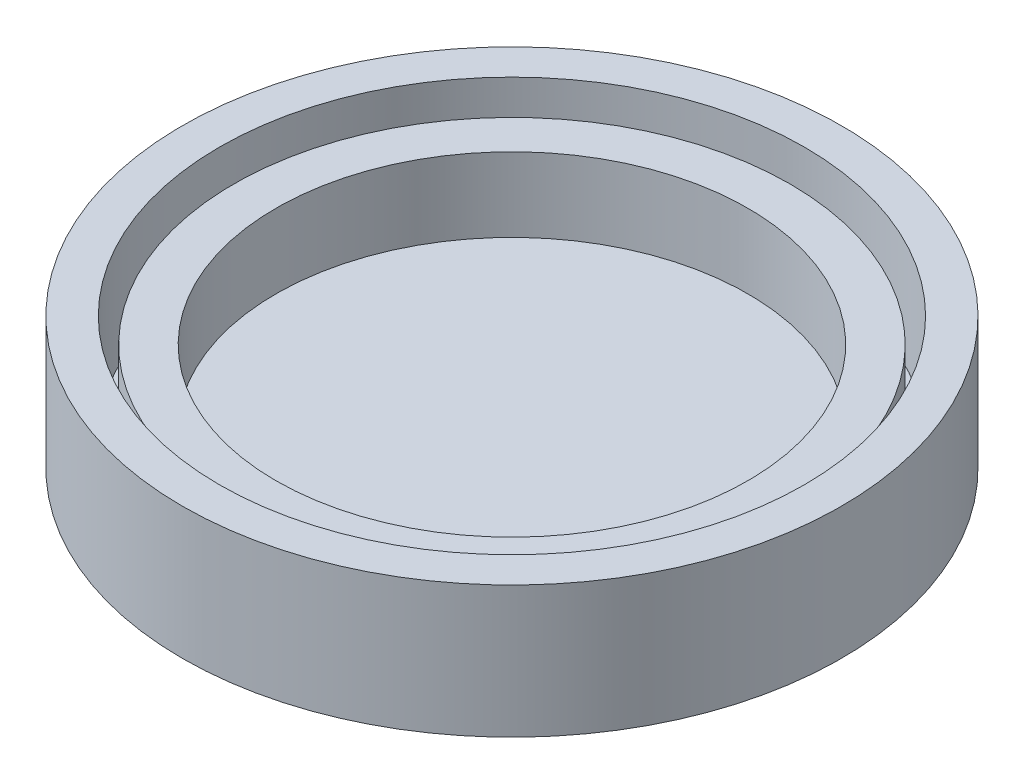
ISO-10303-21;
HEADER;
FILE_DESCRIPTION(('STEP AP214'),'2;1');
FILE_NAME('part.step','',(''),(''),'','','');
FILE_SCHEMA(('AUTOMOTIVE_DESIGN { 1 0 10303 214 1 1 1 1 }'));
ENDSEC;
DATA;
#1=APPLICATION_CONTEXT('core data for automotive mechanical design processes');
#2=APPLICATION_PROTOCOL_DEFINITION('international standard','automotive_design',2000,#1);
#3=PRODUCT_CONTEXT('',#1,'mechanical');
#4=PRODUCT('Part','Part','',(#3));
#5=PRODUCT_RELATED_PRODUCT_CATEGORY('part','',(#4));
#6=PRODUCT_DEFINITION_FORMATION('','',#4);
#7=PRODUCT_DEFINITION_CONTEXT('part definition',#1,'design');
#8=PRODUCT_DEFINITION('design','',#6,#7);
#9=PRODUCT_DEFINITION_SHAPE('','',#8);
#10=(LENGTH_UNIT() NAMED_UNIT(*) SI_UNIT(.MILLI.,.METRE.));
#11=(NAMED_UNIT(*) PLANE_ANGLE_UNIT() SI_UNIT($,.RADIAN.));
#12=(NAMED_UNIT(*) SI_UNIT($,.STERADIAN.) SOLID_ANGLE_UNIT());
#13=UNCERTAINTY_MEASURE_WITH_UNIT(LENGTH_MEASURE(1.E-05),#10,'distance_accuracy_value','');
#14=(GEOMETRIC_REPRESENTATION_CONTEXT(3) GLOBAL_UNCERTAINTY_ASSIGNED_CONTEXT((#13)) GLOBAL_UNIT_ASSIGNED_CONTEXT((#10,
#11,#12)) REPRESENTATION_CONTEXT('',''));
#15=CARTESIAN_POINT('',(0.,0.,0.));
#16=DIRECTION('',(0.,0.,1.));
#17=DIRECTION('',(1.,0.,0.));
#18=AXIS2_PLACEMENT_3D('',#15,#16,#17);
#19=CARTESIAN_POINT('',(0.,16.,0.));
#20=DIRECTION('',(0.,1.,0.));
#21=DIRECTION('',(0.,0.,1.));
#22=AXIS2_PLACEMENT_3D('',#19,#20,#21);
#23=PLANE('',#22);
#24=CARTESIAN_POINT('',(0.,16.,0.));
#25=DIRECTION('',(0.,1.,0.));
#26=DIRECTION('',(0.,0.,1.));
#27=AXIS2_PLACEMENT_3D('',#24,#25,#26);
#28=CIRCLE('',#27,35.5);
#29=CARTESIAN_POINT('',(0.,16.,35.5));
#30=VERTEX_POINT('',#29);
#31=EDGE_CURVE('E55',#30,#30,#28,.T.);
#32=ORIENTED_EDGE('',*,*,#31,.F.);
#33=EDGE_LOOP('',(#32));
#34=FACE_BOUND('',#33,.T.);
#35=CARTESIAN_POINT('',(0.,16.,0.));
#36=DIRECTION('',(0.,1.,0.));
#37=DIRECTION('',(0.,0.,1.));
#38=AXIS2_PLACEMENT_3D('',#35,#36,#37);
#39=CIRCLE('',#38,40.);
#40=CARTESIAN_POINT('',(0.,16.,40.));
#41=VERTEX_POINT('',#40);
#42=EDGE_CURVE('E45',#41,#41,#39,.T.);
#43=ORIENTED_EDGE('',*,*,#42,.T.);
#44=EDGE_LOOP('',(#43));
#45=FACE_BOUND('',#44,.T.);
#46=ADVANCED_FACE('F37',(#34,#45),#23,.T.);
#47=CARTESIAN_POINT('',(0.,0.,0.));
#48=DIRECTION('',(0.,1.,0.));
#49=DIRECTION('',(0.,0.,1.));
#50=AXIS2_PLACEMENT_3D('',#47,#48,#49);
#51=PLANE('',#50);
#52=CARTESIAN_POINT('',(0.,0.,0.));
#53=DIRECTION('',(0.,1.,0.));
#54=DIRECTION('',(0.,0.,1.));
#55=AXIS2_PLACEMENT_3D('',#52,#53,#54);
#56=CIRCLE('',#55,40.);
#57=CARTESIAN_POINT('',(0.,0.,40.));
#58=VERTEX_POINT('',#57);
#59=EDGE_CURVE('E10',#58,#58,#56,.T.);
#60=ORIENTED_EDGE('',*,*,#59,.F.);
#61=EDGE_LOOP('',(#60));
#62=FACE_BOUND('',#61,.T.);
#63=ADVANCED_FACE('F96',(#62),#51,.F.);
#64=CARTESIAN_POINT('',(0.,13.,0.));
#65=DIRECTION('',(0.,-1.,0.));
#66=DIRECTION('',(0.,0.,-1.));
#67=AXIS2_PLACEMENT_3D('',#64,#65,#66);
#68=CYLINDRICAL_SURFACE('',#67,40.);
#69=ORIENTED_EDGE('',*,*,#59,.T.);
#70=EDGE_LOOP('',(#69));
#71=FACE_BOUND('',#70,.T.);
#72=ORIENTED_EDGE('',*,*,#42,.F.);
#73=EDGE_LOOP('',(#72));
#74=FACE_BOUND('',#73,.T.);
#75=ADVANCED_FACE('F39',(#71,#74),#68,.T.);
#76=CARTESIAN_POINT('',(0.,3.,0.));
#77=DIRECTION('',(0.,1.,0.));
#78=DIRECTION('',(0.,0.,1.));
#79=AXIS2_PLACEMENT_3D('',#76,#77,#78);
#80=CYLINDRICAL_SURFACE('',#79,35.5);
#81=CARTESIAN_POINT('',(0.,3.,0.));
#82=DIRECTION('',(0.,1.,0.));
#83=DIRECTION('',(0.,0.,1.));
#84=AXIS2_PLACEMENT_3D('',#81,#82,#83);
#85=CIRCLE('',#84,35.5);
#86=CARTESIAN_POINT('',(0.,3.,35.5));
#87=VERTEX_POINT('',#86);
#88=EDGE_CURVE('E50',#87,#87,#85,.T.);
#89=ORIENTED_EDGE('',*,*,#88,.F.);
#90=EDGE_LOOP('',(#89));
#91=FACE_BOUND('',#90,.T.);
#92=ORIENTED_EDGE('',*,*,#31,.T.);
#93=EDGE_LOOP('',(#92));
#94=FACE_BOUND('',#93,.T.);
#95=ADVANCED_FACE('F106',(#91,#94),#80,.F.);
#96=CARTESIAN_POINT('',(0.,3.,0.));
#97=DIRECTION('',(0.,1.,0.));
#98=DIRECTION('',(0.,0.,1.));
#99=AXIS2_PLACEMENT_3D('',#96,#97,#98);
#100=PLANE('',#99);
#101=CARTESIAN_POINT('',(0.,3.,0.));
#102=DIRECTION('',(0.,1.,0.));
#103=DIRECTION('',(0.,0.,1.));
#104=AXIS2_PLACEMENT_3D('',#101,#102,#103);
#105=CIRCLE('',#104,33.75);
#106=CARTESIAN_POINT('',(0.,3.,-33.75));
#107=VERTEX_POINT('',#106);
#108=EDGE_CURVE('E60',#107,#107,#105,.T.);
#109=ORIENTED_EDGE('',*,*,#108,.F.);
#110=EDGE_LOOP('',(#109));
#111=FACE_BOUND('',#110,.T.);
#112=ORIENTED_EDGE('',*,*,#88,.T.);
#113=EDGE_LOOP('',(#112));
#114=FACE_BOUND('',#113,.T.);
#115=ADVANCED_FACE('F92',(#111,#114),#100,.T.);
#116=CARTESIAN_POINT('',(0.,10.,0.));
#117=DIRECTION('',(0.,-1.,0.));
#118=DIRECTION('',(0.,0.,-1.));
#119=AXIS2_PLACEMENT_3D('',#116,#117,#118);
#120=CYLINDRICAL_SURFACE('',#119,33.75);
#121=CARTESIAN_POINT('',(0.,13.,0.));
#122=DIRECTION('',(0.,1.,0.));
#123=DIRECTION('',(0.,0.,1.));
#124=AXIS2_PLACEMENT_3D('',#121,#122,#123);
#125=CIRCLE('',#124,33.75);
#126=CARTESIAN_POINT('',(0.,13.,-33.75));
#127=VERTEX_POINT('',#126);
#128=EDGE_CURVE('E69',#127,#127,#125,.T.);
#129=CARTESIAN_POINT('',(0.,3.,-33.75));
#130=CARTESIAN_POINT('',(0.,3.10416666666667,-33.75));
#131=CARTESIAN_POINT('',(0.,3.20833333333333,-33.75));
#132=CARTESIAN_POINT('',(0.,3.41666666666667,-33.75));
#133=CARTESIAN_POINT('',(0.,3.52083333333333,-33.75));
#134=CARTESIAN_POINT('',(0.,3.72916666666667,-33.75));
#135=CARTESIAN_POINT('',(0.,3.83333333333333,-33.75));
#136=CARTESIAN_POINT('',(0.,4.04166666666667,-33.75));
#137=CARTESIAN_POINT('',(0.,4.14583333333333,-33.75));
#138=CARTESIAN_POINT('',(0.,4.35416666666667,-33.75));
#139=CARTESIAN_POINT('',(0.,4.45833333333333,-33.75));
#140=CARTESIAN_POINT('',(0.,4.66666666666667,-33.75));
#141=CARTESIAN_POINT('',(0.,4.77083333333333,-33.75));
#142=CARTESIAN_POINT('',(0.,4.97916666666667,-33.75));
#143=CARTESIAN_POINT('',(0.,5.08333333333333,-33.75));
#144=CARTESIAN_POINT('',(0.,5.29166666666667,-33.75));
#145=CARTESIAN_POINT('',(0.,5.39583333333333,-33.75));
#146=CARTESIAN_POINT('',(0.,5.60416666666667,-33.75));
#147=CARTESIAN_POINT('',(0.,5.70833333333333,-33.75));
#148=CARTESIAN_POINT('',(0.,5.91666666666667,-33.75));
#149=CARTESIAN_POINT('',(0.,6.02083333333333,-33.75));
#150=CARTESIAN_POINT('',(0.,6.22916666666667,-33.75));
#151=CARTESIAN_POINT('',(0.,6.33333333333333,-33.75));
#152=CARTESIAN_POINT('',(0.,6.54166666666667,-33.75));
#153=CARTESIAN_POINT('',(0.,6.64583333333333,-33.75));
#154=CARTESIAN_POINT('',(0.,6.85416666666667,-33.75));
#155=CARTESIAN_POINT('',(0.,6.95833333333333,-33.75));
#156=CARTESIAN_POINT('',(0.,7.16666666666667,-33.75));
#157=CARTESIAN_POINT('',(0.,7.27083333333333,-33.75));
#158=CARTESIAN_POINT('',(0.,7.47916666666667,-33.75));
#159=CARTESIAN_POINT('',(0.,7.58333333333333,-33.75));
#160=CARTESIAN_POINT('',(0.,7.79166666666667,-33.75));
#161=CARTESIAN_POINT('',(0.,7.89583333333333,-33.75));
#162=CARTESIAN_POINT('',(0.,8.10416666666667,-33.75));
#163=CARTESIAN_POINT('',(0.,8.20833333333333,-33.75));
#164=CARTESIAN_POINT('',(0.,8.41666666666667,-33.75));
#165=CARTESIAN_POINT('',(0.,8.52083333333333,-33.75));
#166=CARTESIAN_POINT('',(0.,8.72916666666667,-33.75));
#167=CARTESIAN_POINT('',(0.,8.83333333333333,-33.75));
#168=CARTESIAN_POINT('',(0.,9.04166666666667,-33.75));
#169=CARTESIAN_POINT('',(0.,9.14583333333333,-33.75));
#170=CARTESIAN_POINT('',(0.,9.35416666666667,-33.75));
#171=CARTESIAN_POINT('',(0.,9.45833333333333,-33.75));
#172=CARTESIAN_POINT('',(0.,9.66666666666667,-33.75));
#173=CARTESIAN_POINT('',(0.,9.77083333333333,-33.75));
#174=CARTESIAN_POINT('',(0.,9.97916666666667,-33.75));
#175=CARTESIAN_POINT('',(0.,10.0833333333333,-33.75));
#176=CARTESIAN_POINT('',(0.,10.2916666666667,-33.75));
#177=CARTESIAN_POINT('',(0.,10.3958333333333,-33.75));
#178=CARTESIAN_POINT('',(0.,10.6041666666667,-33.75));
#179=CARTESIAN_POINT('',(0.,10.7083333333333,-33.75));
#180=CARTESIAN_POINT('',(0.,10.9166666666667,-33.75));
#181=CARTESIAN_POINT('',(0.,11.0208333333333,-33.75));
#182=CARTESIAN_POINT('',(0.,11.2291666666667,-33.75));
#183=CARTESIAN_POINT('',(0.,11.3333333333333,-33.75));
#184=CARTESIAN_POINT('',(0.,11.5416666666667,-33.75));
#185=CARTESIAN_POINT('',(0.,11.6458333333333,-33.75));
#186=CARTESIAN_POINT('',(0.,11.8541666666667,-33.75));
#187=CARTESIAN_POINT('',(0.,11.9583333333333,-33.75));
#188=CARTESIAN_POINT('',(0.,12.1666666666667,-33.75));
#189=CARTESIAN_POINT('',(0.,12.2708333333333,-33.75));
#190=CARTESIAN_POINT('',(0.,12.4791666666667,-33.75));
#191=CARTESIAN_POINT('',(0.,12.5833333333333,-33.75));
#192=CARTESIAN_POINT('',(0.,12.7916666666667,-33.75));
#193=CARTESIAN_POINT('',(0.,12.8958333333333,-33.75));
#194=CARTESIAN_POINT('',(0.,13.,-33.75));
#195=B_SPLINE_CURVE_WITH_KNOTS('',3,(#129,#130,#131,#132,#133,#134,#135,#136,#137,#138,#139,
#140,#141,#142,#143,#144,#145,#146,#147,#148,#149,#150,#151,#152,#153,#154,#155,#156,#157,#158,
#159,#160,#161,#162,#163,#164,#165,#166,#167,#168,#169,#170,#171,#172,#173,#174,#175,#176,#177,
#178,#179,#180,#181,#182,#183,#184,#185,#186,#187,#188,#189,#190,#191,#192,#193,#194),
.UNSPECIFIED.,.F.,.F.,(4,2,2,2,2,2,2,2,2,2,2,2,2,2,2,2,2,2,2,2,2,2,2,2,2,2,2,2,2,2,2,2,4),(0.,
0.3125,0.625000000000001,0.9375,1.25,1.5625,1.875,2.1875,2.5,2.8125,3.125,3.4375,3.75,4.0625,
4.375,4.6875,5.,5.3125,5.625,5.9375,6.25,6.5625,6.875,7.1875,7.5,7.8125,8.125,8.4375,8.75,
9.0625,9.375,9.6875,10.),.UNSPECIFIED.);
#196=EDGE_CURVE('BSEAM83',#107,#127,#195,.T.);
#197=ORIENTED_EDGE('',*,*,#108,.T.);
#198=ORIENTED_EDGE('',*,*,#128,.F.);
#199=ORIENTED_EDGE('',*,*,#196,.T.);
#200=ORIENTED_EDGE('',*,*,#196,.F.);
#201=EDGE_LOOP('',(#197,#199,#198,#200));
#202=FACE_BOUND('',#201,.T.);
#203=ADVANCED_FACE('F83',(#202),#120,.T.);
#204=CARTESIAN_POINT('',(0.,13.,0.));
#205=DIRECTION('',(0.,1.,0.));
#206=DIRECTION('',(0.,0.,1.));
#207=AXIS2_PLACEMENT_3D('',#204,#205,#206);
#208=PLANE('',#207);
#209=ORIENTED_EDGE('',*,*,#128,.T.);
#210=EDGE_LOOP('',(#209));
#211=FACE_BOUND('',#210,.T.);
#212=CARTESIAN_POINT('',(0.,13.,0.));
#213=DIRECTION('',(0.,1.,0.));
#214=DIRECTION('',(0.,0.,1.));
#215=AXIS2_PLACEMENT_3D('',#212,#213,#214);
#216=CIRCLE('',#215,28.6455284114201);
#217=CARTESIAN_POINT('',(0.,13.,28.6455284114201));
#218=VERTEX_POINT('',#217);
#219=EDGE_CURVE('E73',#218,#218,#216,.T.);
#220=ORIENTED_EDGE('',*,*,#219,.F.);
#221=EDGE_LOOP('',(#220));
#222=FACE_BOUND('',#221,.T.);
#223=ADVANCED_FACE('F80',(#211,#222),#208,.T.);
#224=CARTESIAN_POINT('',(0.,4.,0.));
#225=DIRECTION('',(0.,1.,0.));
#226=DIRECTION('',(0.,0.,1.));
#227=AXIS2_PLACEMENT_3D('',#224,#225,#226);
#228=PLANE('',#227);
#229=CARTESIAN_POINT('',(0.,4.,0.));
#230=DIRECTION('',(0.,1.,0.));
#231=DIRECTION('',(0.,0.,1.));
#232=AXIS2_PLACEMENT_3D('',#229,#230,#231);
#233=CIRCLE('',#232,28.6455284114201);
#234=CARTESIAN_POINT('',(0.,4.,28.6455284114201));
#235=VERTEX_POINT('',#234);
#236=EDGE_CURVE('E65',#235,#235,#233,.T.);
#237=ORIENTED_EDGE('',*,*,#236,.T.);
#238=EDGE_LOOP('',(#237));
#239=FACE_BOUND('',#238,.T.);
#240=ADVANCED_FACE('F82',(#239),#228,.T.);
#241=CARTESIAN_POINT('',(0.,4.,0.));
#242=DIRECTION('',(0.,1.,0.));
#243=DIRECTION('',(0.,0.,1.));
#244=AXIS2_PLACEMENT_3D('',#241,#242,#243);
#245=CYLINDRICAL_SURFACE('',#244,28.6455284114201);
#246=ORIENTED_EDGE('',*,*,#236,.F.);
#247=EDGE_LOOP('',(#246));
#248=FACE_BOUND('',#247,.T.);
#249=ORIENTED_EDGE('',*,*,#219,.T.);
#250=EDGE_LOOP('',(#249));
#251=FACE_BOUND('',#250,.T.);
#252=ADVANCED_FACE('F78',(#248,#251),#245,.F.);
#253=CLOSED_SHELL('',(#46,#63,#75,#95,#115,#203,#223,#240,#252));
#254=MANIFOLD_SOLID_BREP('B2',#253);
#255=ADVANCED_BREP_SHAPE_REPRESENTATION('',(#18,#254),#14);
#256=SHAPE_DEFINITION_REPRESENTATION(#9,#255);
ENDSEC;
END-ISO-10303-21;
